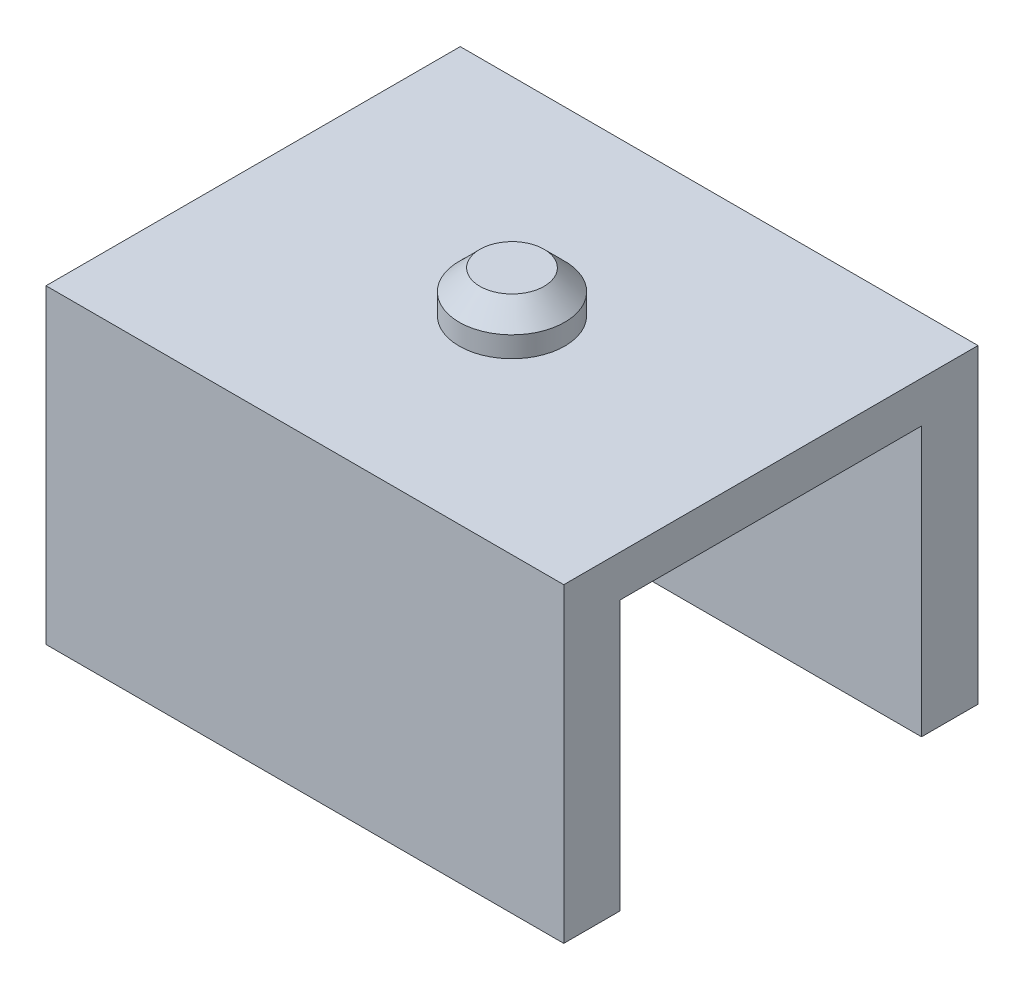
ISO-10303-21;
HEADER;
FILE_DESCRIPTION(('STEP AP214'),'2;1');
FILE_NAME('part.step','',(''),(''),'','','');
FILE_SCHEMA(('AUTOMOTIVE_DESIGN { 1 0 10303 214 1 1 1 1 }'));
ENDSEC;
DATA;
#1=APPLICATION_CONTEXT('core data for automotive mechanical design processes');
#2=APPLICATION_PROTOCOL_DEFINITION('international standard','automotive_design',2000,#1);
#3=PRODUCT_CONTEXT('',#1,'mechanical');
#4=PRODUCT('Part','Part','',(#3));
#5=PRODUCT_RELATED_PRODUCT_CATEGORY('part','',(#4));
#6=PRODUCT_DEFINITION_FORMATION('','',#4);
#7=PRODUCT_DEFINITION_CONTEXT('part definition',#1,'design');
#8=PRODUCT_DEFINITION('design','',#6,#7);
#9=PRODUCT_DEFINITION_SHAPE('','',#8);
#10=(LENGTH_UNIT() NAMED_UNIT(*) SI_UNIT(.MILLI.,.METRE.));
#11=(NAMED_UNIT(*) PLANE_ANGLE_UNIT() SI_UNIT($,.RADIAN.));
#12=(NAMED_UNIT(*) SI_UNIT($,.STERADIAN.) SOLID_ANGLE_UNIT());
#13=UNCERTAINTY_MEASURE_WITH_UNIT(LENGTH_MEASURE(1.E-05),#10,'distance_accuracy_value','');
#14=(GEOMETRIC_REPRESENTATION_CONTEXT(3) GLOBAL_UNCERTAINTY_ASSIGNED_CONTEXT((#13)) GLOBAL_UNIT_ASSIGNED_CONTEXT((#10,
#11,#12)) REPRESENTATION_CONTEXT('',''));
#15=CARTESIAN_POINT('',(0.,0.,0.));
#16=DIRECTION('',(0.,0.,1.));
#17=DIRECTION('',(1.,0.,0.));
#18=AXIS2_PLACEMENT_3D('',#15,#16,#17);
#19=CARTESIAN_POINT('',(25.,0.,20.));
#20=DIRECTION('',(0.,1.,0.));
#21=DIRECTION('',(-1.,0.,0.));
#22=AXIS2_PLACEMENT_3D('',#19,#20,#21);
#23=PLANE('',#22);
#24=DIRECTION('',(0.,0.,-1.));
#25=VECTOR('',#24,1.);
#26=CARTESIAN_POINT('',(0.,0.,20.));
#27=LINE('',#26,#25);
#28=CARTESIAN_POINT('',(0.,0.,20.));
#29=VERTEX_POINT('',#28);
#30=CARTESIAN_POINT('',(0.,0.,17.275));
#31=VERTEX_POINT('',#30);
#32=EDGE_CURVE('E150',#29,#31,#27,.T.);
#33=ORIENTED_EDGE('',*,*,#32,.T.);
#34=DIRECTION('',(-1.,0.,0.));
#35=VECTOR('',#34,1.);
#36=CARTESIAN_POINT('',(25.,0.,17.275));
#37=LINE('',#36,#35);
#38=CARTESIAN_POINT('',(25.,0.,17.275));
#39=VERTEX_POINT('',#38);
#40=EDGE_CURVE('E126',#39,#31,#37,.T.);
#41=ORIENTED_EDGE('',*,*,#40,.F.);
#42=DIRECTION('',(0.,0.,-1.));
#43=VECTOR('',#42,1.);
#44=CARTESIAN_POINT('',(25.,0.,20.));
#45=LINE('',#44,#43);
#46=CARTESIAN_POINT('',(25.,0.,20.));
#47=VERTEX_POINT('',#46);
#48=EDGE_CURVE('E160',#47,#39,#45,.T.);
#49=ORIENTED_EDGE('',*,*,#48,.F.);
#50=DIRECTION('',(1.,0.,0.));
#51=VECTOR('',#50,1.);
#52=CARTESIAN_POINT('',(25.,0.,20.));
#53=LINE('',#52,#51);
#54=EDGE_CURVE('E135',#29,#47,#53,.T.);
#55=ORIENTED_EDGE('',*,*,#54,.F.);
#56=EDGE_LOOP('',(#33,#41,#49,#55));
#57=FACE_BOUND('',#56,.T.);
#58=ADVANCED_FACE('F35',(#57),#23,.F.);
#59=CARTESIAN_POINT('',(25.,0.,2.725));
#60=VERTEX_POINT('',#59);
#61=CARTESIAN_POINT('',(25.,0.,0.));
#62=VERTEX_POINT('',#61);
#63=EDGE_CURVE('E159',#60,#62,#45,.T.);
#64=ORIENTED_EDGE('',*,*,#63,.F.);
#65=DIRECTION('',(1.,0.,0.));
#66=VECTOR('',#65,1.);
#67=CARTESIAN_POINT('',(0.,0.,2.725));
#68=LINE('',#67,#66);
#69=CARTESIAN_POINT('',(0.,0.,2.725));
#70=VERTEX_POINT('',#69);
#71=EDGE_CURVE('E171',#70,#60,#68,.T.);
#72=ORIENTED_EDGE('',*,*,#71,.F.);
#73=CARTESIAN_POINT('',(0.,0.,0.));
#74=VERTEX_POINT('',#73);
#75=EDGE_CURVE('E82',#70,#74,#27,.T.);
#76=ORIENTED_EDGE('',*,*,#75,.T.);
#77=DIRECTION('',(1.,0.,0.));
#78=VECTOR('',#77,1.);
#79=CARTESIAN_POINT('',(25.,0.,0.));
#80=LINE('',#79,#78);
#81=EDGE_CURVE('E142',#74,#62,#80,.T.);
#82=ORIENTED_EDGE('',*,*,#81,.T.);
#83=EDGE_LOOP('',(#64,#72,#76,#82));
#84=FACE_BOUND('',#83,.T.);
#85=ADVANCED_FACE('F184',(#84),#23,.F.);
#86=CARTESIAN_POINT('',(25.,15.,20.));
#87=DIRECTION('',(-1.,0.,0.));
#88=DIRECTION('',(0.,-1.,0.));
#89=AXIS2_PLACEMENT_3D('',#86,#87,#88);
#90=PLANE('',#89);
#91=ORIENTED_EDGE('',*,*,#48,.T.);
#92=DIRECTION('',(0.,-1.,0.));
#93=VECTOR('',#92,1.);
#94=CARTESIAN_POINT('',(25.,13.,17.275));
#95=LINE('',#94,#93);
#96=CARTESIAN_POINT('',(25.,13.,17.275));
#97=VERTEX_POINT('',#96);
#98=EDGE_CURVE('E130',#97,#39,#95,.T.);
#99=ORIENTED_EDGE('',*,*,#98,.F.);
#100=DIRECTION('',(0.,0.,1.));
#101=VECTOR('',#100,1.);
#102=CARTESIAN_POINT('',(25.,13.,2.725));
#103=LINE('',#102,#101);
#104=CARTESIAN_POINT('',(25.,13.,2.725));
#105=VERTEX_POINT('',#104);
#106=EDGE_CURVE('E119',#105,#97,#103,.T.);
#107=ORIENTED_EDGE('',*,*,#106,.F.);
#108=DIRECTION('',(0.,-1.,0.));
#109=VECTOR('',#108,1.);
#110=CARTESIAN_POINT('',(25.,13.,2.725));
#111=LINE('',#110,#109);
#112=EDGE_CURVE('E117',#105,#60,#111,.T.);
#113=ORIENTED_EDGE('',*,*,#112,.T.);
#114=ORIENTED_EDGE('',*,*,#63,.T.);
#115=DIRECTION('',(0.,1.,0.));
#116=VECTOR('',#115,1.);
#117=CARTESIAN_POINT('',(25.,15.,0.));
#118=LINE('',#117,#116);
#119=CARTESIAN_POINT('',(25.,15.,0.));
#120=VERTEX_POINT('',#119);
#121=EDGE_CURVE('E144',#62,#120,#118,.T.);
#122=ORIENTED_EDGE('',*,*,#121,.T.);
#123=DIRECTION('',(0.,0.,-1.));
#124=VECTOR('',#123,1.);
#125=CARTESIAN_POINT('',(25.,15.,20.));
#126=LINE('',#125,#124);
#127=CARTESIAN_POINT('',(25.,15.,20.));
#128=VERTEX_POINT('',#127);
#129=EDGE_CURVE('E156',#128,#120,#126,.T.);
#130=ORIENTED_EDGE('',*,*,#129,.F.);
#131=DIRECTION('',(0.,1.,0.));
#132=VECTOR('',#131,1.);
#133=CARTESIAN_POINT('',(25.,15.,20.));
#134=LINE('',#133,#132);
#135=EDGE_CURVE('E90',#47,#128,#134,.T.);
#136=ORIENTED_EDGE('',*,*,#135,.F.);
#137=EDGE_LOOP('',(#91,#99,#107,#113,#114,#122,#130,#136));
#138=FACE_BOUND('',#137,.T.);
#139=ADVANCED_FACE('F181',(#138),#90,.F.);
#140=CARTESIAN_POINT('',(0.,15.,20.));
#141=DIRECTION('',(0.,-1.,0.));
#142=DIRECTION('',(0.,0.,-1.));
#143=AXIS2_PLACEMENT_3D('',#140,#141,#142);
#144=PLANE('',#143);
#145=CARTESIAN_POINT('',(12.5,15.,10.));
#146=DIRECTION('',(0.,1.,0.));
#147=DIRECTION('',(0.,0.,1.));
#148=AXIS2_PLACEMENT_3D('',#145,#146,#147);
#149=CIRCLE('',#148,2.55);
#150=CARTESIAN_POINT('',(12.5,15.,12.55));
#151=VERTEX_POINT('',#150);
#152=EDGE_CURVE('E161',#151,#151,#149,.T.);
#153=ORIENTED_EDGE('',*,*,#152,.F.);
#154=EDGE_LOOP('',(#153));
#155=FACE_BOUND('',#154,.T.);
#156=DIRECTION('',(-1.,0.,0.));
#157=VECTOR('',#156,1.);
#158=CARTESIAN_POINT('',(0.,15.,0.));
#159=LINE('',#158,#157);
#160=CARTESIAN_POINT('',(0.,15.,0.));
#161=VERTEX_POINT('',#160);
#162=EDGE_CURVE('E147',#120,#161,#159,.T.);
#163=ORIENTED_EDGE('',*,*,#162,.T.);
#164=DIRECTION('',(0.,0.,-1.));
#165=VECTOR('',#164,1.);
#166=CARTESIAN_POINT('',(0.,15.,20.));
#167=LINE('',#166,#165);
#168=CARTESIAN_POINT('',(0.,15.,20.));
#169=VERTEX_POINT('',#168);
#170=EDGE_CURVE('E153',#169,#161,#167,.T.);
#171=ORIENTED_EDGE('',*,*,#170,.F.);
#172=DIRECTION('',(-1.,0.,0.));
#173=VECTOR('',#172,1.);
#174=CARTESIAN_POINT('',(0.,15.,20.));
#175=LINE('',#174,#173);
#176=EDGE_CURVE('E139',#128,#169,#175,.T.);
#177=ORIENTED_EDGE('',*,*,#176,.F.);
#178=ORIENTED_EDGE('',*,*,#129,.T.);
#179=EDGE_LOOP('',(#163,#171,#177,#178));
#180=FACE_BOUND('',#179,.T.);
#181=ADVANCED_FACE('F183',(#155,#180),#144,.F.);
#182=CARTESIAN_POINT('',(0.,0.,20.));
#183=DIRECTION('',(1.,0.,0.));
#184=DIRECTION('',(0.,0.,-1.));
#185=AXIS2_PLACEMENT_3D('',#182,#183,#184);
#186=PLANE('',#185);
#187=DIRECTION('',(0.,0.,-1.));
#188=VECTOR('',#187,1.);
#189=CARTESIAN_POINT('',(0.,13.,17.275));
#190=LINE('',#189,#188);
#191=CARTESIAN_POINT('',(0.,13.,17.275));
#192=VERTEX_POINT('',#191);
#193=CARTESIAN_POINT('',(0.,13.,2.725));
#194=VERTEX_POINT('',#193);
#195=EDGE_CURVE('E120',#192,#194,#190,.T.);
#196=ORIENTED_EDGE('',*,*,#195,.F.);
#197=DIRECTION('',(0.,-1.,0.));
#198=VECTOR('',#197,1.);
#199=CARTESIAN_POINT('',(0.,13.,17.275));
#200=LINE('',#199,#198);
#201=EDGE_CURVE('E145',#192,#31,#200,.T.);
#202=ORIENTED_EDGE('',*,*,#201,.T.);
#203=ORIENTED_EDGE('',*,*,#32,.F.);
#204=DIRECTION('',(0.,-1.,0.));
#205=VECTOR('',#204,1.);
#206=CARTESIAN_POINT('',(0.,0.,20.));
#207=LINE('',#206,#205);
#208=EDGE_CURVE('E60',#169,#29,#207,.T.);
#209=ORIENTED_EDGE('',*,*,#208,.F.);
#210=ORIENTED_EDGE('',*,*,#170,.T.);
#211=DIRECTION('',(0.,-1.,0.));
#212=VECTOR('',#211,1.);
#213=CARTESIAN_POINT('',(0.,0.,0.));
#214=LINE('',#213,#212);
#215=EDGE_CURVE('E137',#161,#74,#214,.T.);
#216=ORIENTED_EDGE('',*,*,#215,.T.);
#217=ORIENTED_EDGE('',*,*,#75,.F.);
#218=DIRECTION('',(0.,-1.,0.));
#219=VECTOR('',#218,1.);
#220=CARTESIAN_POINT('',(0.,13.,2.725));
#221=LINE('',#220,#219);
#222=EDGE_CURVE('E115',#194,#70,#221,.T.);
#223=ORIENTED_EDGE('',*,*,#222,.F.);
#224=EDGE_LOOP('',(#196,#202,#203,#209,#210,#216,#217,#223));
#225=FACE_BOUND('',#224,.T.);
#226=ADVANCED_FACE('F128',(#225),#186,.F.);
#227=CARTESIAN_POINT('',(0.,0.,20.));
#228=DIRECTION('',(0.,0.,-1.));
#229=DIRECTION('',(-1.,0.,0.));
#230=AXIS2_PLACEMENT_3D('',#227,#228,#229);
#231=PLANE('',#230);
#232=ORIENTED_EDGE('',*,*,#54,.T.);
#233=ORIENTED_EDGE('',*,*,#135,.T.);
#234=ORIENTED_EDGE('',*,*,#176,.T.);
#235=ORIENTED_EDGE('',*,*,#208,.T.);
#236=EDGE_LOOP('',(#232,#233,#234,#235));
#237=FACE_BOUND('',#236,.T.);
#238=ADVANCED_FACE('F214',(#237),#231,.F.);
#239=CARTESIAN_POINT('',(0.,0.,0.));
#240=DIRECTION('',(0.,0.,-1.));
#241=DIRECTION('',(-1.,0.,0.));
#242=AXIS2_PLACEMENT_3D('',#239,#240,#241);
#243=PLANE('',#242);
#244=ORIENTED_EDGE('',*,*,#81,.F.);
#245=ORIENTED_EDGE('',*,*,#215,.F.);
#246=ORIENTED_EDGE('',*,*,#162,.F.);
#247=ORIENTED_EDGE('',*,*,#121,.F.);
#248=EDGE_LOOP('',(#244,#245,#246,#247));
#249=FACE_BOUND('',#248,.T.);
#250=ADVANCED_FACE('F225',(#249),#243,.T.);
#251=CARTESIAN_POINT('',(25.,13.,17.275));
#252=DIRECTION('',(0.,0.,1.));
#253=DIRECTION('',(1.,0.,0.));
#254=AXIS2_PLACEMENT_3D('',#251,#252,#253);
#255=PLANE('',#254);
#256=ORIENTED_EDGE('',*,*,#40,.T.);
#257=ORIENTED_EDGE('',*,*,#201,.F.);
#258=DIRECTION('',(-1.,0.,0.));
#259=VECTOR('',#258,1.);
#260=CARTESIAN_POINT('',(25.,13.,17.275));
#261=LINE('',#260,#259);
#262=EDGE_CURVE('E51',#97,#192,#261,.T.);
#263=ORIENTED_EDGE('',*,*,#262,.F.);
#264=ORIENTED_EDGE('',*,*,#98,.T.);
#265=EDGE_LOOP('',(#256,#257,#263,#264));
#266=FACE_BOUND('',#265,.T.);
#267=ADVANCED_FACE('F177',(#266),#255,.F.);
#268=CARTESIAN_POINT('',(0.,13.,2.725));
#269=DIRECTION('',(0.,0.,-1.));
#270=DIRECTION('',(-1.,0.,0.));
#271=AXIS2_PLACEMENT_3D('',#268,#269,#270);
#272=PLANE('',#271);
#273=ORIENTED_EDGE('',*,*,#71,.T.);
#274=ORIENTED_EDGE('',*,*,#112,.F.);
#275=DIRECTION('',(1.,0.,0.));
#276=VECTOR('',#275,1.);
#277=CARTESIAN_POINT('',(0.,13.,2.725));
#278=LINE('',#277,#276);
#279=EDGE_CURVE('E112',#194,#105,#278,.T.);
#280=ORIENTED_EDGE('',*,*,#279,.F.);
#281=ORIENTED_EDGE('',*,*,#222,.T.);
#282=EDGE_LOOP('',(#273,#274,#280,#281));
#283=FACE_BOUND('',#282,.T.);
#284=ADVANCED_FACE('F113',(#283),#272,.F.);
#285=CARTESIAN_POINT('',(0.,13.,0.));
#286=DIRECTION('',(0.,-1.,0.));
#287=DIRECTION('',(1.,0.,0.));
#288=AXIS2_PLACEMENT_3D('',#285,#286,#287);
#289=PLANE('',#288);
#290=ORIENTED_EDGE('',*,*,#195,.T.);
#291=ORIENTED_EDGE('',*,*,#279,.T.);
#292=ORIENTED_EDGE('',*,*,#106,.T.);
#293=ORIENTED_EDGE('',*,*,#262,.T.);
#294=EDGE_LOOP('',(#290,#291,#292,#293));
#295=FACE_BOUND('',#294,.T.);
#296=ADVANCED_FACE('F123',(#295),#289,.T.);
#297=CARTESIAN_POINT('',(12.5,17.,10.));
#298=DIRECTION('',(0.,-1.,0.));
#299=DIRECTION('',(0.,0.,-1.));
#300=AXIS2_PLACEMENT_3D('',#297,#298,#299);
#301=CYLINDRICAL_SURFACE('',#300,2.55);
#302=CARTESIAN_POINT('',(12.5,16.,10.));
#303=DIRECTION('',(0.,1.,0.));
#304=DIRECTION('',(0.,0.,1.));
#305=AXIS2_PLACEMENT_3D('',#302,#303,#304);
#306=CIRCLE('',#305,2.55);
#307=CARTESIAN_POINT('',(12.5,16.,12.55));
#308=VERTEX_POINT('',#307);
#309=EDGE_CURVE('E11',#308,#308,#306,.F.);
#310=ORIENTED_EDGE('',*,*,#309,.T.);
#311=EDGE_LOOP('',(#310));
#312=FACE_BOUND('',#311,.T.);
#313=ORIENTED_EDGE('',*,*,#152,.T.);
#314=EDGE_LOOP('',(#313));
#315=FACE_BOUND('',#314,.T.);
#316=ADVANCED_FACE('F243',(#312,#315),#301,.T.);
#317=CARTESIAN_POINT('',(12.5,17.,10.));
#318=DIRECTION('',(0.,1.,0.));
#319=DIRECTION('',(0.,0.,1.));
#320=AXIS2_PLACEMENT_3D('',#317,#318,#319);
#321=PLANE('',#320);
#322=CARTESIAN_POINT('',(12.5,17.,10.));
#323=DIRECTION('',(0.,1.,0.));
#324=DIRECTION('',(0.,0.,1.));
#325=AXIS2_PLACEMENT_3D('',#322,#323,#324);
#326=CIRCLE('',#325,1.55000000000001);
#327=CARTESIAN_POINT('',(12.5,17.,11.55));
#328=VERTEX_POINT('',#327);
#329=EDGE_CURVE('E44',#328,#328,#326,.T.);
#330=ORIENTED_EDGE('',*,*,#329,.T.);
#331=EDGE_LOOP('',(#330));
#332=FACE_BOUND('',#331,.T.);
#333=ADVANCED_FACE('F257',(#332),#321,.T.);
#334=CARTESIAN_POINT('',(12.5,17.,10.));
#335=DIRECTION('',(0.,-1.,0.));
#336=DIRECTION('',(0.,0.,-1.));
#337=AXIS2_PLACEMENT_3D('',#334,#335,#336);
#338=CONICAL_SURFACE('',#337,1.55000000000001,0.785398163397447);
#339=ORIENTED_EDGE('',*,*,#309,.F.);
#340=EDGE_LOOP('',(#339));
#341=FACE_BOUND('',#340,.T.);
#342=ORIENTED_EDGE('',*,*,#329,.F.);
#343=EDGE_LOOP('',(#342));
#344=FACE_BOUND('',#343,.T.);
#345=ADVANCED_FACE('F38',(#341,#344),#338,.T.);
#346=CLOSED_SHELL('',(#58,#85,#139,#181,#226,#238,#250,#267,#284,#296,#316,#333,#345));
#347=MANIFOLD_SOLID_BREP('B2',#346);
#348=ADVANCED_BREP_SHAPE_REPRESENTATION('',(#18,#347),#14);
#349=SHAPE_DEFINITION_REPRESENTATION(#9,#348);
ENDSEC;
END-ISO-10303-21;
